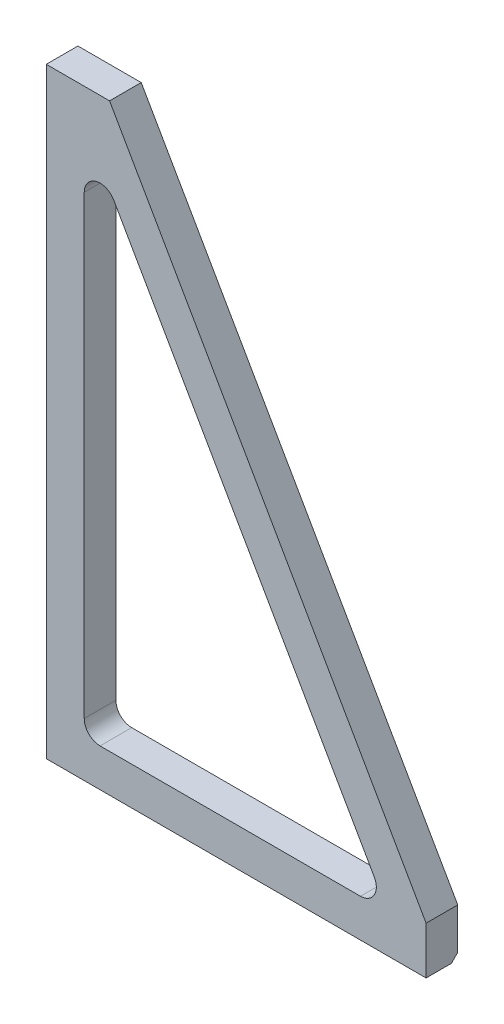
ISO-10303-21;
HEADER;
FILE_DESCRIPTION(('STEP AP214'),'2;1');
FILE_NAME('part.step','',(''),(''),'','','');
FILE_SCHEMA(('AUTOMOTIVE_DESIGN { 1 0 10303 214 1 1 1 1 }'));
ENDSEC;
DATA;
#1=APPLICATION_CONTEXT('core data for automotive mechanical design processes');
#2=APPLICATION_PROTOCOL_DEFINITION('international standard','automotive_design',2000,#1);
#3=PRODUCT_CONTEXT('',#1,'mechanical');
#4=PRODUCT('Part','Part','',(#3));
#5=PRODUCT_RELATED_PRODUCT_CATEGORY('part','',(#4));
#6=PRODUCT_DEFINITION_FORMATION('','',#4);
#7=PRODUCT_DEFINITION_CONTEXT('part definition',#1,'design');
#8=PRODUCT_DEFINITION('design','',#6,#7);
#9=PRODUCT_DEFINITION_SHAPE('','',#8);
#10=(LENGTH_UNIT() NAMED_UNIT(*) SI_UNIT(.MILLI.,.METRE.));
#11=(NAMED_UNIT(*) PLANE_ANGLE_UNIT() SI_UNIT($,.RADIAN.));
#12=(NAMED_UNIT(*) SI_UNIT($,.STERADIAN.) SOLID_ANGLE_UNIT());
#13=UNCERTAINTY_MEASURE_WITH_UNIT(LENGTH_MEASURE(1.E-05),#10,'distance_accuracy_value','');
#14=(GEOMETRIC_REPRESENTATION_CONTEXT(3) GLOBAL_UNCERTAINTY_ASSIGNED_CONTEXT((#13)) GLOBAL_UNIT_ASSIGNED_CONTEXT((#10,
#11,#12)) REPRESENTATION_CONTEXT('',''));
#15=CARTESIAN_POINT('',(0.,0.,0.));
#16=DIRECTION('',(0.,0.,1.));
#17=DIRECTION('',(1.,0.,0.));
#18=AXIS2_PLACEMENT_3D('',#15,#16,#17);
#19=CARTESIAN_POINT('',(0.,241.3,12.7));
#20=DIRECTION('',(0.,0.,-1.));
#21=DIRECTION('',(-1.,0.,0.));
#22=AXIS2_PLACEMENT_3D('',#19,#20,#21);
#23=PLANE('',#22);
#24=DIRECTION('',(0.,-1.,0.));
#25=VECTOR('',#24,1.);
#26=CARTESIAN_POINT('',(0.,0.,12.7));
#27=LINE('',#26,#25);
#28=CARTESIAN_POINT('',(0.,241.3,12.7));
#29=VERTEX_POINT('',#28);
#30=CARTESIAN_POINT('',(0.,0.,12.7));
#31=VERTEX_POINT('',#30);
#32=EDGE_CURVE('E182',#29,#31,#27,.T.);
#33=ORIENTED_EDGE('',*,*,#32,.T.);
#34=DIRECTION('',(1.,0.,0.));
#35=VECTOR('',#34,1.);
#36=CARTESIAN_POINT('',(0.,0.,12.7));
#37=LINE('',#36,#35);
#38=CARTESIAN_POINT('',(152.4,0.,12.7));
#39=VERTEX_POINT('',#38);
#40=EDGE_CURVE('E185',#31,#39,#37,.T.);
#41=ORIENTED_EDGE('',*,*,#40,.T.);
#42=DIRECTION('',(0.,1.,0.));
#43=VECTOR('',#42,1.);
#44=CARTESIAN_POINT('',(152.4,0.,12.7));
#45=LINE('',#44,#43);
#46=CARTESIAN_POINT('',(152.4,19.05,12.7));
#47=VERTEX_POINT('',#46);
#48=EDGE_CURVE('E188',#39,#47,#45,.T.);
#49=ORIENTED_EDGE('',*,*,#48,.T.);
#50=DIRECTION('',(-0.496138938356834,0.868243142124459,0.));
#51=VECTOR('',#50,1.);
#52=CARTESIAN_POINT('',(25.4,241.3,12.7));
#53=LINE('',#52,#51);
#54=CARTESIAN_POINT('',(25.4,241.3,12.7));
#55=VERTEX_POINT('',#54);
#56=EDGE_CURVE('E190',#47,#55,#53,.T.);
#57=ORIENTED_EDGE('',*,*,#56,.T.);
#58=DIRECTION('',(-1.,0.,0.));
#59=VECTOR('',#58,1.);
#60=CARTESIAN_POINT('',(0.,241.3,12.7));
#61=LINE('',#60,#59);
#62=EDGE_CURVE('E192',#55,#29,#61,.T.);
#63=ORIENTED_EDGE('',*,*,#62,.T.);
#64=EDGE_LOOP('',(#33,#41,#49,#57,#63));
#65=FACE_BOUND('',#64,.T.);
#66=CARTESIAN_POINT('',(126.082265030605,21.59,12.7));
#67=DIRECTION('',(0.,0.,1.));
#68=DIRECTION('',(-1.,0.,0.));
#69=AXIS2_PLACEMENT_3D('',#66,#67,#68);
#70=CIRCLE('',#69,6.35);
#71=CARTESIAN_POINT('',(126.082265030605,15.24,12.7));
#72=VERTEX_POINT('',#71);
#73=CARTESIAN_POINT('',(131.595608983095,24.7404822585659,12.7));
#74=VERTEX_POINT('',#73);
#75=EDGE_CURVE('E126',#72,#74,#70,.T.);
#76=ORIENTED_EDGE('',*,*,#75,.F.);
#77=DIRECTION('',(1.,0.,0.));
#78=VECTOR('',#77,1.);
#79=CARTESIAN_POINT('',(21.59,15.24,12.7));
#80=LINE('',#79,#78);
#81=CARTESIAN_POINT('',(21.59,15.24,12.7));
#82=VERTEX_POINT('',#81);
#83=EDGE_CURVE('E158',#82,#72,#80,.T.);
#84=ORIENTED_EDGE('',*,*,#83,.F.);
#85=CARTESIAN_POINT('',(21.59,21.59,12.7));
#86=DIRECTION('',(0.,0.,1.));
#87=DIRECTION('',(1.,0.,0.));
#88=AXIS2_PLACEMENT_3D('',#85,#86,#87);
#89=CIRCLE('',#88,6.35);
#90=CARTESIAN_POINT('',(15.24,21.59,12.7));
#91=VERTEX_POINT('',#90);
#92=EDGE_CURVE('E155',#91,#82,#89,.T.);
#93=ORIENTED_EDGE('',*,*,#92,.F.);
#94=DIRECTION('',(0.,-1.,0.));
#95=VECTOR('',#94,1.);
#96=CARTESIAN_POINT('',(15.24,21.59,12.7));
#97=LINE('',#96,#95);
#98=CARTESIAN_POINT('',(15.24,204.451463803559,12.7));
#99=VERTEX_POINT('',#98);
#100=EDGE_CURVE('E151',#99,#91,#97,.T.);
#101=ORIENTED_EDGE('',*,*,#100,.F.);
#102=CARTESIAN_POINT('',(21.59,204.451463803559,12.7));
#103=DIRECTION('',(0.,0.,1.));
#104=DIRECTION('',(-1.,0.,0.));
#105=AXIS2_PLACEMENT_3D('',#102,#103,#104);
#106=CIRCLE('',#105,6.35000000000001);
#107=CARTESIAN_POINT('',(27.1033439524903,207.601946062124,12.7));
#108=VERTEX_POINT('',#107);
#109=EDGE_CURVE('E149',#108,#99,#106,.T.);
#110=ORIENTED_EDGE('',*,*,#109,.F.);
#111=DIRECTION('',(-0.496138938356834,0.868243142124459,0.));
#112=VECTOR('',#111,1.);
#113=CARTESIAN_POINT('',(27.1033439524903,207.601946062124,12.7));
#114=LINE('',#113,#112);
#115=EDGE_CURVE('E136',#74,#108,#114,.T.);
#116=ORIENTED_EDGE('',*,*,#115,.F.);
#117=EDGE_LOOP('',(#76,#84,#93,#101,#110,#116));
#118=FACE_BOUND('',#117,.T.);
#119=ADVANCED_FACE('F37',(#65,#118),#23,.F.);
#120=CARTESIAN_POINT('',(0.,241.3,0.));
#121=DIRECTION('',(0.,0.,-1.));
#122=DIRECTION('',(-1.,0.,0.));
#123=AXIS2_PLACEMENT_3D('',#120,#121,#122);
#124=PLANE('',#123);
#125=DIRECTION('',(0.,1.,0.));
#126=VECTOR('',#125,1.);
#127=CARTESIAN_POINT('',(152.4,0.,0.));
#128=LINE('',#127,#126);
#129=CARTESIAN_POINT('',(152.4,2.54000000000001,0.));
#130=VERTEX_POINT('',#129);
#131=CARTESIAN_POINT('',(152.4,19.05,0.));
#132=VERTEX_POINT('',#131);
#133=EDGE_CURVE('E196',#130,#132,#128,.T.);
#134=ORIENTED_EDGE('',*,*,#133,.F.);
#135=DIRECTION('',(-1.,0.,0.));
#136=VECTOR('',#135,1.);
#137=CARTESIAN_POINT('',(0.,2.54000000000001,0.));
#138=LINE('',#137,#136);
#139=CARTESIAN_POINT('',(0.,2.54000000000001,0.));
#140=VERTEX_POINT('',#139);
#141=EDGE_CURVE('E45',#130,#140,#138,.T.);
#142=ORIENTED_EDGE('',*,*,#141,.T.);
#143=DIRECTION('',(0.,-1.,0.));
#144=VECTOR('',#143,1.);
#145=CARTESIAN_POINT('',(0.,0.,0.));
#146=LINE('',#145,#144);
#147=CARTESIAN_POINT('',(0.,241.3,0.));
#148=VERTEX_POINT('',#147);
#149=EDGE_CURVE('E144',#148,#140,#146,.T.);
#150=ORIENTED_EDGE('',*,*,#149,.F.);
#151=DIRECTION('',(-1.,0.,0.));
#152=VECTOR('',#151,1.);
#153=CARTESIAN_POINT('',(0.,241.3,0.));
#154=LINE('',#153,#152);
#155=CARTESIAN_POINT('',(25.4,241.3,0.));
#156=VERTEX_POINT('',#155);
#157=EDGE_CURVE('E186',#156,#148,#154,.T.);
#158=ORIENTED_EDGE('',*,*,#157,.F.);
#159=DIRECTION('',(-0.496138938356834,0.868243142124459,0.));
#160=VECTOR('',#159,1.);
#161=CARTESIAN_POINT('',(25.4,241.3,0.));
#162=LINE('',#161,#160);
#163=EDGE_CURVE('E198',#132,#156,#162,.T.);
#164=ORIENTED_EDGE('',*,*,#163,.F.);
#165=EDGE_LOOP('',(#134,#142,#150,#158,#164));
#166=FACE_BOUND('',#165,.T.);
#167=DIRECTION('',(1.,0.,0.));
#168=VECTOR('',#167,1.);
#169=CARTESIAN_POINT('',(21.59,15.24,0.));
#170=LINE('',#169,#168);
#171=CARTESIAN_POINT('',(21.59,15.24,0.));
#172=VERTEX_POINT('',#171);
#173=CARTESIAN_POINT('',(126.082265030605,15.24,0.));
#174=VERTEX_POINT('',#173);
#175=EDGE_CURVE('E137',#172,#174,#170,.T.);
#176=ORIENTED_EDGE('',*,*,#175,.T.);
#177=CARTESIAN_POINT('',(126.082265030605,21.59,0.));
#178=DIRECTION('',(0.,0.,1.));
#179=DIRECTION('',(-1.,0.,0.));
#180=AXIS2_PLACEMENT_3D('',#177,#178,#179);
#181=CIRCLE('',#180,6.35);
#182=CARTESIAN_POINT('',(131.595608983095,24.7404822585659,0.));
#183=VERTEX_POINT('',#182);
#184=EDGE_CURVE('E160',#174,#183,#181,.T.);
#185=ORIENTED_EDGE('',*,*,#184,.T.);
#186=DIRECTION('',(-0.496138938356834,0.868243142124459,0.));
#187=VECTOR('',#186,1.);
#188=CARTESIAN_POINT('',(27.1033439524903,207.601946062124,0.));
#189=LINE('',#188,#187);
#190=CARTESIAN_POINT('',(27.1033439524903,207.601946062124,0.));
#191=VERTEX_POINT('',#190);
#192=EDGE_CURVE('E143',#183,#191,#189,.T.);
#193=ORIENTED_EDGE('',*,*,#192,.T.);
#194=CARTESIAN_POINT('',(21.59,204.451463803559,0.));
#195=DIRECTION('',(0.,0.,1.));
#196=DIRECTION('',(-1.,0.,0.));
#197=AXIS2_PLACEMENT_3D('',#194,#195,#196);
#198=CIRCLE('',#197,6.35000000000001);
#199=CARTESIAN_POINT('',(15.24,204.451463803559,0.));
#200=VERTEX_POINT('',#199);
#201=EDGE_CURVE('E163',#191,#200,#198,.T.);
#202=ORIENTED_EDGE('',*,*,#201,.T.);
#203=DIRECTION('',(0.,-1.,0.));
#204=VECTOR('',#203,1.);
#205=CARTESIAN_POINT('',(15.24,21.59,0.));
#206=LINE('',#205,#204);
#207=CARTESIAN_POINT('',(15.24,21.59,0.));
#208=VERTEX_POINT('',#207);
#209=EDGE_CURVE('E166',#200,#208,#206,.T.);
#210=ORIENTED_EDGE('',*,*,#209,.T.);
#211=CARTESIAN_POINT('',(21.59,21.59,0.));
#212=DIRECTION('',(0.,0.,1.));
#213=DIRECTION('',(1.,0.,0.));
#214=AXIS2_PLACEMENT_3D('',#211,#212,#213);
#215=CIRCLE('',#214,6.35);
#216=EDGE_CURVE('E169',#208,#172,#215,.T.);
#217=ORIENTED_EDGE('',*,*,#216,.T.);
#218=EDGE_LOOP('',(#176,#185,#193,#202,#210,#217));
#219=FACE_BOUND('',#218,.T.);
#220=ADVANCED_FACE('F244',(#166,#219),#124,.T.);
#221=CARTESIAN_POINT('',(0.,0.,12.7));
#222=DIRECTION('',(1.,0.,0.));
#223=DIRECTION('',(0.,0.,-1.));
#224=AXIS2_PLACEMENT_3D('',#221,#222,#223);
#225=PLANE('',#224);
#226=ORIENTED_EDGE('',*,*,#149,.T.);
#227=DIRECTION('',(0.,-0.70710678118655,0.707106781186546));
#228=VECTOR('',#227,1.);
#229=CARTESIAN_POINT('',(0.,0.,2.54));
#230=LINE('',#229,#228);
#231=CARTESIAN_POINT('',(0.,0.,2.54));
#232=VERTEX_POINT('',#231);
#233=EDGE_CURVE('E11',#140,#232,#230,.T.);
#234=ORIENTED_EDGE('',*,*,#233,.T.);
#235=DIRECTION('',(0.,0.,-1.));
#236=VECTOR('',#235,1.);
#237=CARTESIAN_POINT('',(0.,0.,12.7));
#238=LINE('',#237,#236);
#239=EDGE_CURVE('E211',#31,#232,#238,.T.);
#240=ORIENTED_EDGE('',*,*,#239,.F.);
#241=ORIENTED_EDGE('',*,*,#32,.F.);
#242=DIRECTION('',(0.,0.,-1.));
#243=VECTOR('',#242,1.);
#244=CARTESIAN_POINT('',(0.,241.3,12.7));
#245=LINE('',#244,#243);
#246=EDGE_CURVE('E194',#29,#148,#245,.T.);
#247=ORIENTED_EDGE('',*,*,#246,.T.);
#248=EDGE_LOOP('',(#226,#234,#240,#241,#247));
#249=FACE_BOUND('',#248,.T.);
#250=ADVANCED_FACE('F234',(#249),#225,.F.);
#251=CARTESIAN_POINT('',(0.,0.,12.7));
#252=DIRECTION('',(0.,1.,0.));
#253=DIRECTION('',(0.,0.,1.));
#254=AXIS2_PLACEMENT_3D('',#251,#252,#253);
#255=PLANE('',#254);
#256=ORIENTED_EDGE('',*,*,#239,.T.);
#257=DIRECTION('',(1.,0.,0.));
#258=VECTOR('',#257,1.);
#259=CARTESIAN_POINT('',(152.4,0.,2.54));
#260=LINE('',#259,#258);
#261=CARTESIAN_POINT('',(152.4,0.,2.54));
#262=VERTEX_POINT('',#261);
#263=EDGE_CURVE('E214',#232,#262,#260,.T.);
#264=ORIENTED_EDGE('',*,*,#263,.T.);
#265=DIRECTION('',(0.,0.,-1.));
#266=VECTOR('',#265,1.);
#267=CARTESIAN_POINT('',(152.4,0.,12.7));
#268=LINE('',#267,#266);
#269=EDGE_CURVE('E209',#39,#262,#268,.T.);
#270=ORIENTED_EDGE('',*,*,#269,.F.);
#271=ORIENTED_EDGE('',*,*,#40,.F.);
#272=EDGE_LOOP('',(#256,#264,#270,#271));
#273=FACE_BOUND('',#272,.T.);
#274=ADVANCED_FACE('F220',(#273),#255,.F.);
#275=CARTESIAN_POINT('',(152.4,0.,12.7));
#276=DIRECTION('',(-1.,0.,0.));
#277=DIRECTION('',(0.,0.,1.));
#278=AXIS2_PLACEMENT_3D('',#275,#276,#277);
#279=PLANE('',#278);
#280=ORIENTED_EDGE('',*,*,#269,.T.);
#281=DIRECTION('',(0.,0.70710678118655,-0.707106781186546));
#282=VECTOR('',#281,1.);
#283=CARTESIAN_POINT('',(152.4,0.,2.54));
#284=LINE('',#283,#282);
#285=EDGE_CURVE('E59',#262,#130,#284,.T.);
#286=ORIENTED_EDGE('',*,*,#285,.T.);
#287=ORIENTED_EDGE('',*,*,#133,.T.);
#288=DIRECTION('',(0.,0.,-1.));
#289=VECTOR('',#288,1.);
#290=CARTESIAN_POINT('',(152.4,19.05,12.7));
#291=LINE('',#290,#289);
#292=EDGE_CURVE('E206',#47,#132,#291,.T.);
#293=ORIENTED_EDGE('',*,*,#292,.F.);
#294=ORIENTED_EDGE('',*,*,#48,.F.);
#295=EDGE_LOOP('',(#280,#286,#287,#293,#294));
#296=FACE_BOUND('',#295,.T.);
#297=ADVANCED_FACE('F225',(#296),#279,.F.);
#298=CARTESIAN_POINT('',(25.4,241.3,12.7));
#299=DIRECTION('',(-0.868243142124459,-0.496138938356834,0.));
#300=DIRECTION('',(0.496138938356834,-0.868243142124459,0.));
#301=AXIS2_PLACEMENT_3D('',#298,#299,#300);
#302=PLANE('',#301);
#303=ORIENTED_EDGE('',*,*,#163,.T.);
#304=DIRECTION('',(0.,0.,-1.));
#305=VECTOR('',#304,1.);
#306=CARTESIAN_POINT('',(25.4,241.3,12.7));
#307=LINE('',#306,#305);
#308=EDGE_CURVE('E203',#55,#156,#307,.T.);
#309=ORIENTED_EDGE('',*,*,#308,.F.);
#310=ORIENTED_EDGE('',*,*,#56,.F.);
#311=ORIENTED_EDGE('',*,*,#292,.T.);
#312=EDGE_LOOP('',(#303,#309,#310,#311));
#313=FACE_BOUND('',#312,.T.);
#314=ADVANCED_FACE('F256',(#313),#302,.F.);
#315=CARTESIAN_POINT('',(0.,241.3,12.7));
#316=DIRECTION('',(0.,-1.,0.));
#317=DIRECTION('',(0.,0.,-1.));
#318=AXIS2_PLACEMENT_3D('',#315,#316,#317);
#319=PLANE('',#318);
#320=ORIENTED_EDGE('',*,*,#157,.T.);
#321=ORIENTED_EDGE('',*,*,#246,.F.);
#322=ORIENTED_EDGE('',*,*,#62,.F.);
#323=ORIENTED_EDGE('',*,*,#308,.T.);
#324=EDGE_LOOP('',(#320,#321,#322,#323));
#325=FACE_BOUND('',#324,.T.);
#326=ADVANCED_FACE('F253',(#325),#319,.F.);
#327=CARTESIAN_POINT('',(126.082265030605,21.59,12.7));
#328=DIRECTION('',(0.,0.,-1.));
#329=DIRECTION('',(-1.,0.,0.));
#330=AXIS2_PLACEMENT_3D('',#327,#328,#329);
#331=CYLINDRICAL_SURFACE('',#330,6.35);
#332=ORIENTED_EDGE('',*,*,#184,.F.);
#333=DIRECTION('',(0.,0.,-1.));
#334=VECTOR('',#333,1.);
#335=CARTESIAN_POINT('',(126.082265030605,15.24,12.7));
#336=LINE('',#335,#334);
#337=EDGE_CURVE('E132',#72,#174,#336,.T.);
#338=ORIENTED_EDGE('',*,*,#337,.F.);
#339=ORIENTED_EDGE('',*,*,#75,.T.);
#340=DIRECTION('',(0.,0.,-1.));
#341=VECTOR('',#340,1.);
#342=CARTESIAN_POINT('',(131.595608983095,24.7404822585659,12.7));
#343=LINE('',#342,#341);
#344=EDGE_CURVE('E129',#74,#183,#343,.T.);
#345=ORIENTED_EDGE('',*,*,#344,.T.);
#346=EDGE_LOOP('',(#332,#338,#339,#345));
#347=FACE_BOUND('',#346,.T.);
#348=ADVANCED_FACE('F128',(#347),#331,.F.);
#349=CARTESIAN_POINT('',(27.1033439524903,207.601946062124,12.7));
#350=DIRECTION('',(-0.868243142124459,-0.496138938356834,0.));
#351=DIRECTION('',(0.496138938356834,-0.868243142124459,0.));
#352=AXIS2_PLACEMENT_3D('',#349,#350,#351);
#353=PLANE('',#352);
#354=ORIENTED_EDGE('',*,*,#192,.F.);
#355=ORIENTED_EDGE('',*,*,#344,.F.);
#356=ORIENTED_EDGE('',*,*,#115,.T.);
#357=DIRECTION('',(0.,0.,-1.));
#358=VECTOR('',#357,1.);
#359=CARTESIAN_POINT('',(27.1033439524903,207.601946062124,12.7));
#360=LINE('',#359,#358);
#361=EDGE_CURVE('E145',#108,#191,#360,.T.);
#362=ORIENTED_EDGE('',*,*,#361,.T.);
#363=EDGE_LOOP('',(#354,#355,#356,#362));
#364=FACE_BOUND('',#363,.T.);
#365=ADVANCED_FACE('F140',(#364),#353,.T.);
#366=CARTESIAN_POINT('',(21.59,204.451463803559,12.7));
#367=DIRECTION('',(0.,0.,-1.));
#368=DIRECTION('',(-1.,0.,0.));
#369=AXIS2_PLACEMENT_3D('',#366,#367,#368);
#370=CYLINDRICAL_SURFACE('',#369,6.35000000000001);
#371=ORIENTED_EDGE('',*,*,#201,.F.);
#372=ORIENTED_EDGE('',*,*,#361,.F.);
#373=ORIENTED_EDGE('',*,*,#109,.T.);
#374=DIRECTION('',(0.,0.,-1.));
#375=VECTOR('',#374,1.);
#376=CARTESIAN_POINT('',(15.24,204.451463803559,12.7));
#377=LINE('',#376,#375);
#378=EDGE_CURVE('E179',#99,#200,#377,.T.);
#379=ORIENTED_EDGE('',*,*,#378,.T.);
#380=EDGE_LOOP('',(#371,#372,#373,#379));
#381=FACE_BOUND('',#380,.T.);
#382=ADVANCED_FACE('F296',(#381),#370,.F.);
#383=CARTESIAN_POINT('',(15.24,21.59,12.7));
#384=DIRECTION('',(1.,0.,0.));
#385=DIRECTION('',(0.,0.,-1.));
#386=AXIS2_PLACEMENT_3D('',#383,#384,#385);
#387=PLANE('',#386);
#388=ORIENTED_EDGE('',*,*,#209,.F.);
#389=ORIENTED_EDGE('',*,*,#378,.F.);
#390=ORIENTED_EDGE('',*,*,#100,.T.);
#391=DIRECTION('',(0.,0.,-1.));
#392=VECTOR('',#391,1.);
#393=CARTESIAN_POINT('',(15.24,21.59,12.7));
#394=LINE('',#393,#392);
#395=EDGE_CURVE('E177',#91,#208,#394,.T.);
#396=ORIENTED_EDGE('',*,*,#395,.T.);
#397=EDGE_LOOP('',(#388,#389,#390,#396));
#398=FACE_BOUND('',#397,.T.);
#399=ADVANCED_FACE('F302',(#398),#387,.T.);
#400=CARTESIAN_POINT('',(21.59,21.59,12.7));
#401=DIRECTION('',(0.,0.,-1.));
#402=DIRECTION('',(-1.,0.,0.));
#403=AXIS2_PLACEMENT_3D('',#400,#401,#402);
#404=CYLINDRICAL_SURFACE('',#403,6.35);
#405=ORIENTED_EDGE('',*,*,#216,.F.);
#406=ORIENTED_EDGE('',*,*,#395,.F.);
#407=ORIENTED_EDGE('',*,*,#92,.T.);
#408=DIRECTION('',(0.,0.,-1.));
#409=VECTOR('',#408,1.);
#410=CARTESIAN_POINT('',(21.59,15.24,12.7));
#411=LINE('',#410,#409);
#412=EDGE_CURVE('E175',#82,#172,#411,.T.);
#413=ORIENTED_EDGE('',*,*,#412,.T.);
#414=EDGE_LOOP('',(#405,#406,#407,#413));
#415=FACE_BOUND('',#414,.T.);
#416=ADVANCED_FACE('F240',(#415),#404,.F.);
#417=CARTESIAN_POINT('',(21.59,15.24,12.7));
#418=DIRECTION('',(0.,1.,0.));
#419=DIRECTION('',(0.,0.,1.));
#420=AXIS2_PLACEMENT_3D('',#417,#418,#419);
#421=PLANE('',#420);
#422=ORIENTED_EDGE('',*,*,#175,.F.);
#423=ORIENTED_EDGE('',*,*,#412,.F.);
#424=ORIENTED_EDGE('',*,*,#83,.T.);
#425=ORIENTED_EDGE('',*,*,#337,.T.);
#426=EDGE_LOOP('',(#422,#423,#424,#425));
#427=FACE_BOUND('',#426,.T.);
#428=ADVANCED_FACE('F236',(#427),#421,.T.);
#429=CARTESIAN_POINT('',(0.,0.,2.54));
#430=DIRECTION('',(0.,-0.707106781186546,-0.70710678118655));
#431=DIRECTION('',(0.,0.70710678118655,-0.707106781186546));
#432=AXIS2_PLACEMENT_3D('',#429,#430,#431);
#433=PLANE('',#432);
#434=ORIENTED_EDGE('',*,*,#233,.F.);
#435=ORIENTED_EDGE('',*,*,#141,.F.);
#436=ORIENTED_EDGE('',*,*,#285,.F.);
#437=ORIENTED_EDGE('',*,*,#263,.F.);
#438=EDGE_LOOP('',(#434,#435,#436,#437));
#439=FACE_BOUND('',#438,.T.);
#440=ADVANCED_FACE('F39',(#439),#433,.T.);
#441=CLOSED_SHELL('',(#119,#220,#250,#274,#297,#314,#326,#348,#365,#382,#399,#416,#428,#440));
#442=MANIFOLD_SOLID_BREP('B2',#441);
#443=ADVANCED_BREP_SHAPE_REPRESENTATION('',(#18,#442),#14);
#444=SHAPE_DEFINITION_REPRESENTATION(#9,#443);
ENDSEC;
END-ISO-10303-21;
